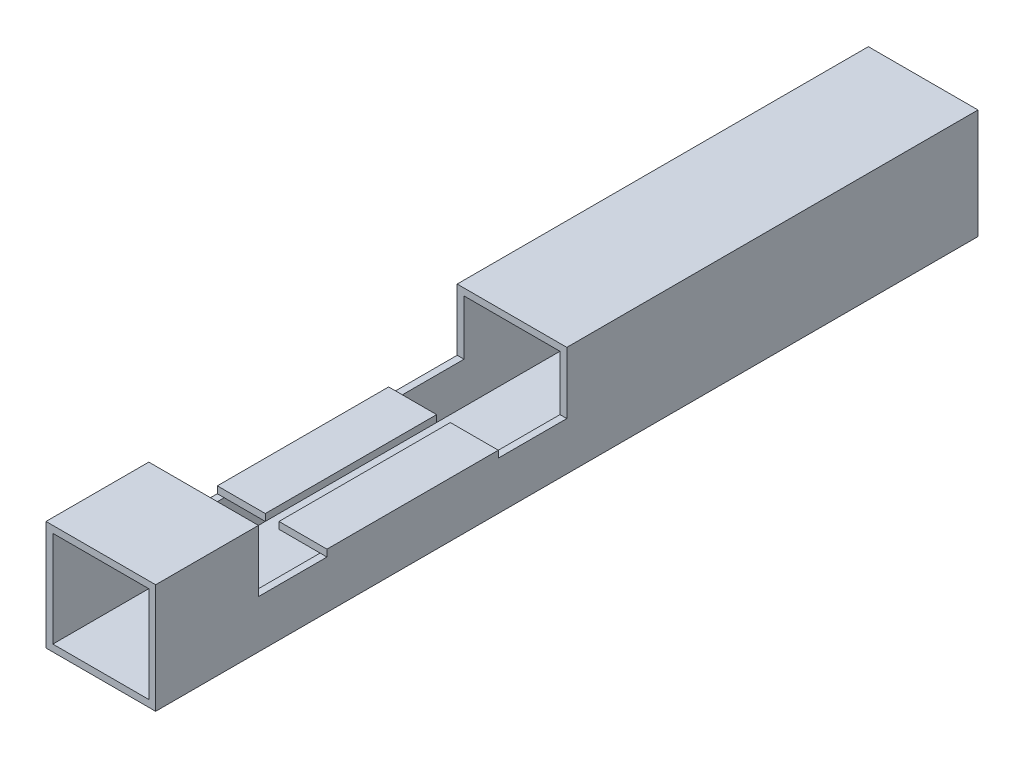
ISO-10303-21;
HEADER;
FILE_DESCRIPTION(('STEP AP214'),'2;1');
FILE_NAME('part.step','',(''),(''),'','','');
FILE_SCHEMA(('AUTOMOTIVE_DESIGN { 1 0 10303 214 1 1 1 1 }'));
ENDSEC;
DATA;
#1=APPLICATION_CONTEXT('core data for automotive mechanical design processes');
#2=APPLICATION_PROTOCOL_DEFINITION('international standard','automotive_design',2000,#1);
#3=PRODUCT_CONTEXT('',#1,'mechanical');
#4=PRODUCT('Part','Part','',(#3));
#5=PRODUCT_RELATED_PRODUCT_CATEGORY('part','',(#4));
#6=PRODUCT_DEFINITION_FORMATION('','',#4);
#7=PRODUCT_DEFINITION_CONTEXT('part definition',#1,'design');
#8=PRODUCT_DEFINITION('design','',#6,#7);
#9=PRODUCT_DEFINITION_SHAPE('','',#8);
#10=(LENGTH_UNIT() NAMED_UNIT(*) SI_UNIT(.MILLI.,.METRE.));
#11=(NAMED_UNIT(*) PLANE_ANGLE_UNIT() SI_UNIT($,.RADIAN.));
#12=(NAMED_UNIT(*) SI_UNIT($,.STERADIAN.) SOLID_ANGLE_UNIT());
#13=UNCERTAINTY_MEASURE_WITH_UNIT(LENGTH_MEASURE(1.E-05),#10,'distance_accuracy_value','');
#14=(GEOMETRIC_REPRESENTATION_CONTEXT(3) GLOBAL_UNCERTAINTY_ASSIGNED_CONTEXT((#13)) GLOBAL_UNIT_ASSIGNED_CONTEXT((#10,
#11,#12)) REPRESENTATION_CONTEXT('',''));
#15=CARTESIAN_POINT('',(0.,0.,0.));
#16=DIRECTION('',(0.,0.,1.));
#17=DIRECTION('',(1.,0.,0.));
#18=AXIS2_PLACEMENT_3D('',#15,#16,#17);
#19=CARTESIAN_POINT('',(-0.0999999999999999,0.,0.));
#20=DIRECTION('',(1.,0.,0.));
#21=DIRECTION('',(0.,0.,-1.));
#22=AXIS2_PLACEMENT_3D('',#19,#20,#21);
#23=PLANE('',#22);
#24=DIRECTION('',(0.,1.,0.));
#25=VECTOR('',#24,1.);
#26=CARTESIAN_POINT('',(-0.0999999999999999,-0.0999999999999999,1.));
#27=LINE('',#26,#25);
#28=CARTESIAN_POINT('',(-0.0999999999999999,-0.0999999999999999,1.));
#29=VERTEX_POINT('',#28);
#30=CARTESIAN_POINT('',(-0.0999999999999999,0.,1.));
#31=VERTEX_POINT('',#30);
#32=EDGE_CURVE('E198',#29,#31,#27,.T.);
#33=ORIENTED_EDGE('',*,*,#32,.T.);
#34=DIRECTION('',(0.,0.,-1.));
#35=VECTOR('',#34,1.);
#36=CARTESIAN_POINT('',(-0.0999999999999999,0.,3.5));
#37=LINE('',#36,#35);
#38=CARTESIAN_POINT('',(-0.0999999999999999,0.,3.5));
#39=VERTEX_POINT('',#38);
#40=EDGE_CURVE('E239',#31,#39,#37,.F.);
#41=ORIENTED_EDGE('',*,*,#40,.T.);
#42=DIRECTION('',(0.,1.,0.));
#43=VECTOR('',#42,1.);
#44=CARTESIAN_POINT('',(-0.0999999999999999,0.,3.5));
#45=LINE('',#44,#43);
#46=CARTESIAN_POINT('',(-0.0999999999999999,-0.0999999999999999,3.5));
#47=VERTEX_POINT('',#46);
#48=EDGE_CURVE('E20',#39,#47,#45,.F.);
#49=ORIENTED_EDGE('',*,*,#48,.T.);
#50=DIRECTION('',(0.,0.,1.));
#51=VECTOR('',#50,1.);
#52=CARTESIAN_POINT('',(-0.0999999999999999,-0.0999999999999999,3.5));
#53=LINE('',#52,#51);
#54=EDGE_CURVE('E185',#47,#29,#53,.F.);
#55=ORIENTED_EDGE('',*,*,#54,.T.);
#56=EDGE_LOOP('',(#33,#41,#49,#55));
#57=FACE_BOUND('',#56,.T.);
#58=ADVANCED_FACE('F17',(#57),#23,.T.);
#59=CARTESIAN_POINT('',(-0.0999999999999999,-0.0999999999999999,3.5));
#60=DIRECTION('',(0.,1.,0.));
#61=DIRECTION('',(0.,0.,1.));
#62=AXIS2_PLACEMENT_3D('',#59,#60,#61);
#63=PLANE('',#62);
#64=DIRECTION('',(1.,0.,0.));
#65=VECTOR('',#64,1.);
#66=CARTESIAN_POINT('',(-0.0999999999999999,-0.0999999999999999,1.));
#67=LINE('',#66,#65);
#68=CARTESIAN_POINT('',(-0.7,-0.0999999999999999,1.));
#69=VERTEX_POINT('',#68);
#70=EDGE_CURVE('E190',#69,#29,#67,.T.);
#71=ORIENTED_EDGE('',*,*,#70,.T.);
#72=ORIENTED_EDGE('',*,*,#54,.F.);
#73=DIRECTION('',(-1.,0.,0.));
#74=VECTOR('',#73,1.);
#75=CARTESIAN_POINT('',(-0.0999999999999999,-0.0999999999999999,3.5));
#76=LINE('',#75,#74);
#77=CARTESIAN_POINT('',(-0.7,-0.0999999999999999,3.5));
#78=VERTEX_POINT('',#77);
#79=EDGE_CURVE('E206',#47,#78,#76,.T.);
#80=ORIENTED_EDGE('',*,*,#79,.T.);
#81=DIRECTION('',(0.,0.,-1.));
#82=VECTOR('',#81,1.);
#83=CARTESIAN_POINT('',(-0.7,-0.0999999999999999,6.));
#84=LINE('',#83,#82);
#85=EDGE_CURVE('E202',#69,#78,#84,.F.);
#86=ORIENTED_EDGE('',*,*,#85,.F.);
#87=EDGE_LOOP('',(#71,#72,#80,#86));
#88=FACE_BOUND('',#87,.T.);
#89=ADVANCED_FACE('F204',(#88),#63,.F.);
#90=CARTESIAN_POINT('',(0.0999999999999999,0.,0.));
#91=DIRECTION('',(-1.,0.,0.));
#92=DIRECTION('',(0.,0.,1.));
#93=AXIS2_PLACEMENT_3D('',#90,#91,#92);
#94=PLANE('',#93);
#95=DIRECTION('',(0.,1.,0.));
#96=VECTOR('',#95,1.);
#97=CARTESIAN_POINT('',(0.0999999999999999,0.,1.));
#98=LINE('',#97,#96);
#99=CARTESIAN_POINT('',(0.0999999999999999,0.,1.));
#100=VERTEX_POINT('',#99);
#101=CARTESIAN_POINT('',(0.0999999999999999,-0.0999999999999999,1.));
#102=VERTEX_POINT('',#101);
#103=EDGE_CURVE('E236',#100,#102,#98,.F.);
#104=ORIENTED_EDGE('',*,*,#103,.T.);
#105=DIRECTION('',(0.,0.,-1.));
#106=VECTOR('',#105,1.);
#107=CARTESIAN_POINT('',(0.0999999999999999,-0.0999999999999999,3.5));
#108=LINE('',#107,#106);
#109=CARTESIAN_POINT('',(0.0999999999999999,-0.0999999999999999,3.5));
#110=VERTEX_POINT('',#109);
#111=EDGE_CURVE('E233',#110,#102,#108,.T.);
#112=ORIENTED_EDGE('',*,*,#111,.F.);
#113=DIRECTION('',(0.,1.,0.));
#114=VECTOR('',#113,1.);
#115=CARTESIAN_POINT('',(0.0999999999999999,-0.0999999999999999,3.5));
#116=LINE('',#115,#114);
#117=CARTESIAN_POINT('',(0.0999999999999999,0.,3.5));
#118=VERTEX_POINT('',#117);
#119=EDGE_CURVE('E339',#118,#110,#116,.F.);
#120=ORIENTED_EDGE('',*,*,#119,.F.);
#121=DIRECTION('',(0.,0.,1.));
#122=VECTOR('',#121,1.);
#123=CARTESIAN_POINT('',(0.0999999999999999,0.,3.5));
#124=LINE('',#123,#122);
#125=EDGE_CURVE('E335',#100,#118,#124,.T.);
#126=ORIENTED_EDGE('',*,*,#125,.F.);
#127=EDGE_LOOP('',(#104,#112,#120,#126));
#128=FACE_BOUND('',#127,.T.);
#129=ADVANCED_FACE('F469',(#128),#94,.T.);
#130=CARTESIAN_POINT('',(0.0999999999999999,-0.0999999999999999,3.5));
#131=DIRECTION('',(0.,-1.,0.));
#132=DIRECTION('',(0.,0.,-1.));
#133=AXIS2_PLACEMENT_3D('',#130,#131,#132);
#134=PLANE('',#133);
#135=DIRECTION('',(1.,0.,0.));
#136=VECTOR('',#135,1.);
#137=CARTESIAN_POINT('',(0.0999999999999999,-0.0999999999999999,3.5));
#138=LINE('',#137,#136);
#139=CARTESIAN_POINT('',(0.7,-0.0999999999999999,3.5));
#140=VERTEX_POINT('',#139);
#141=EDGE_CURVE('E337',#110,#140,#138,.T.);
#142=ORIENTED_EDGE('',*,*,#141,.F.);
#143=ORIENTED_EDGE('',*,*,#111,.T.);
#144=DIRECTION('',(-1.,0.,0.));
#145=VECTOR('',#144,1.);
#146=CARTESIAN_POINT('',(0.0999999999999999,-0.0999999999999999,1.));
#147=LINE('',#146,#145);
#148=CARTESIAN_POINT('',(0.7,-0.0999999999999999,1.));
#149=VERTEX_POINT('',#148);
#150=EDGE_CURVE('E330',#149,#102,#147,.T.);
#151=ORIENTED_EDGE('',*,*,#150,.F.);
#152=DIRECTION('',(0.,0.,1.));
#153=VECTOR('',#152,1.);
#154=CARTESIAN_POINT('',(0.7,-0.0999999999999999,6.));
#155=LINE('',#154,#153);
#156=EDGE_CURVE('E288',#140,#149,#155,.F.);
#157=ORIENTED_EDGE('',*,*,#156,.F.);
#158=EDGE_LOOP('',(#142,#143,#151,#157));
#159=FACE_BOUND('',#158,.T.);
#160=ADVANCED_FACE('F476',(#159),#134,.T.);
#161=CARTESIAN_POINT('',(0.,0.7,6.));
#162=DIRECTION('',(0.,-1.,0.));
#163=DIRECTION('',(0.,0.,-1.));
#164=AXIS2_PLACEMENT_3D('',#161,#162,#163);
#165=PLANE('',#164);
#166=DIRECTION('',(1.,0.,0.));
#167=VECTOR('',#166,1.);
#168=CARTESIAN_POINT('',(0.,0.7,-6.));
#169=LINE('',#168,#167);
#170=CARTESIAN_POINT('',(-0.7,0.7,-6.));
#171=VERTEX_POINT('',#170);
#172=CARTESIAN_POINT('',(0.7,0.7,-6.));
#173=VERTEX_POINT('',#172);
#174=EDGE_CURVE('E231',#171,#173,#169,.T.);
#175=ORIENTED_EDGE('',*,*,#174,.T.);
#176=DIRECTION('',(0.,0.,1.));
#177=VECTOR('',#176,1.);
#178=CARTESIAN_POINT('',(0.7,0.7,6.));
#179=LINE('',#178,#177);
#180=CARTESIAN_POINT('',(0.7,0.7,0.));
#181=VERTEX_POINT('',#180);
#182=EDGE_CURVE('E280',#181,#173,#179,.F.);
#183=ORIENTED_EDGE('',*,*,#182,.F.);
#184=DIRECTION('',(-1.,0.,0.));
#185=VECTOR('',#184,1.);
#186=CARTESIAN_POINT('',(-0.8,0.7,0.));
#187=LINE('',#186,#185);
#188=CARTESIAN_POINT('',(-0.7,0.7,0.));
#189=VERTEX_POINT('',#188);
#190=EDGE_CURVE('E322',#181,#189,#187,.T.);
#191=ORIENTED_EDGE('',*,*,#190,.T.);
#192=DIRECTION('',(0.,0.,-1.));
#193=VECTOR('',#192,1.);
#194=CARTESIAN_POINT('',(-0.7,0.7,6.));
#195=LINE('',#194,#193);
#196=EDGE_CURVE('E218',#171,#189,#195,.F.);
#197=ORIENTED_EDGE('',*,*,#196,.F.);
#198=EDGE_LOOP('',(#175,#183,#191,#197));
#199=FACE_BOUND('',#198,.T.);
#200=ADVANCED_FACE('F406',(#199),#165,.T.);
#201=CARTESIAN_POINT('',(0.,-0.7,6.));
#202=DIRECTION('',(0.,1.,0.));
#203=DIRECTION('',(0.,0.,1.));
#204=AXIS2_PLACEMENT_3D('',#201,#202,#203);
#205=PLANE('',#204);
#206=DIRECTION('',(1.,0.,0.));
#207=VECTOR('',#206,1.);
#208=CARTESIAN_POINT('',(0.,-0.7,6.));
#209=LINE('',#208,#207);
#210=CARTESIAN_POINT('',(-0.7,-0.7,6.));
#211=VERTEX_POINT('',#210);
#212=CARTESIAN_POINT('',(0.7,-0.7,6.));
#213=VERTEX_POINT('',#212);
#214=EDGE_CURVE('E224',#211,#213,#209,.T.);
#215=ORIENTED_EDGE('',*,*,#214,.T.);
#216=DIRECTION('',(0.,0.,1.));
#217=VECTOR('',#216,1.);
#218=CARTESIAN_POINT('',(0.7,-0.7,6.));
#219=LINE('',#218,#217);
#220=CARTESIAN_POINT('',(0.7,-0.7,-6.));
#221=VERTEX_POINT('',#220);
#222=EDGE_CURVE('E277',#221,#213,#219,.T.);
#223=ORIENTED_EDGE('',*,*,#222,.F.);
#224=DIRECTION('',(1.,0.,0.));
#225=VECTOR('',#224,1.);
#226=CARTESIAN_POINT('',(0.,-0.7,-6.));
#227=LINE('',#226,#225);
#228=CARTESIAN_POINT('',(-0.7,-0.7,-6.));
#229=VERTEX_POINT('',#228);
#230=EDGE_CURVE('E226',#221,#229,#227,.F.);
#231=ORIENTED_EDGE('',*,*,#230,.T.);
#232=DIRECTION('',(0.,0.,-1.));
#233=VECTOR('',#232,1.);
#234=CARTESIAN_POINT('',(-0.7,-0.7,6.));
#235=LINE('',#234,#233);
#236=EDGE_CURVE('E345',#211,#229,#235,.T.);
#237=ORIENTED_EDGE('',*,*,#236,.F.);
#238=EDGE_LOOP('',(#215,#223,#231,#237));
#239=FACE_BOUND('',#238,.T.);
#240=ADVANCED_FACE('F398',(#239),#205,.T.);
#241=CARTESIAN_POINT('',(-0.8,-0.0999999999999999,4.5));
#242=DIRECTION('',(0.,-1.,0.));
#243=DIRECTION('',(0.,0.,-1.));
#244=AXIS2_PLACEMENT_3D('',#241,#242,#243);
#245=PLANE('',#244);
#246=DIRECTION('',(0.,0.,-1.));
#247=VECTOR('',#246,1.);
#248=CARTESIAN_POINT('',(-0.7,-0.0999999999999999,6.));
#249=LINE('',#248,#247);
#250=CARTESIAN_POINT('',(-0.7,-0.0999999999999999,0.));
#251=VERTEX_POINT('',#250);
#252=EDGE_CURVE('E210',#251,#69,#249,.F.);
#253=ORIENTED_EDGE('',*,*,#252,.F.);
#254=DIRECTION('',(-1.,0.,0.));
#255=VECTOR('',#254,1.);
#256=CARTESIAN_POINT('',(-0.8,-0.0999999999999999,0.));
#257=LINE('',#256,#255);
#258=CARTESIAN_POINT('',(-0.8,-0.0999999999999999,0.));
#259=VERTEX_POINT('',#258);
#260=EDGE_CURVE('E319',#251,#259,#257,.T.);
#261=ORIENTED_EDGE('',*,*,#260,.T.);
#262=DIRECTION('',(0.,0.,-1.));
#263=VECTOR('',#262,1.);
#264=CARTESIAN_POINT('',(-0.8,-0.0999999999999999,6.));
#265=LINE('',#264,#263);
#266=CARTESIAN_POINT('',(-0.8,-0.0999999999999999,1.));
#267=VERTEX_POINT('',#266);
#268=EDGE_CURVE('E223',#259,#267,#265,.F.);
#269=ORIENTED_EDGE('',*,*,#268,.T.);
#270=DIRECTION('',(1.,0.,0.));
#271=VECTOR('',#270,1.);
#272=CARTESIAN_POINT('',(-0.0999999999999999,-0.0999999999999999,1.));
#273=LINE('',#272,#271);
#274=EDGE_CURVE('E196',#267,#69,#273,.T.);
#275=ORIENTED_EDGE('',*,*,#274,.T.);
#276=EDGE_LOOP('',(#253,#261,#269,#275));
#277=FACE_BOUND('',#276,.T.);
#278=ADVANCED_FACE('F221',(#277),#245,.F.);
#279=CARTESIAN_POINT('',(-0.0999999999999999,-0.0999999999999999,1.));
#280=DIRECTION('',(0.,0.,1.));
#281=DIRECTION('',(1.,0.,0.));
#282=AXIS2_PLACEMENT_3D('',#279,#280,#281);
#283=PLANE('',#282);
#284=DIRECTION('',(1.,0.,0.));
#285=VECTOR('',#284,1.);
#286=CARTESIAN_POINT('',(-0.0999999999999999,0.,1.));
#287=LINE('',#286,#285);
#288=CARTESIAN_POINT('',(-0.8,0.,1.));
#289=VERTEX_POINT('',#288);
#290=EDGE_CURVE('E254',#289,#31,#287,.T.);
#291=ORIENTED_EDGE('',*,*,#290,.T.);
#292=ORIENTED_EDGE('',*,*,#32,.F.);
#293=ORIENTED_EDGE('',*,*,#70,.F.);
#294=ORIENTED_EDGE('',*,*,#274,.F.);
#295=DIRECTION('',(0.,1.,0.));
#296=VECTOR('',#295,1.);
#297=CARTESIAN_POINT('',(-0.8,-0.8,1.));
#298=LINE('',#297,#296);
#299=EDGE_CURVE('E259',#267,#289,#298,.T.);
#300=ORIENTED_EDGE('',*,*,#299,.T.);
#301=EDGE_LOOP('',(#291,#292,#293,#294,#300));
#302=FACE_BOUND('',#301,.T.);
#303=ADVANCED_FACE('F193',(#302),#283,.F.);
#304=CARTESIAN_POINT('',(-0.0999999999999999,0.,3.5));
#305=DIRECTION('',(0.,-1.,0.));
#306=DIRECTION('',(0.,0.,-1.));
#307=AXIS2_PLACEMENT_3D('',#304,#305,#306);
#308=PLANE('',#307);
#309=DIRECTION('',(-1.,0.,0.));
#310=VECTOR('',#309,1.);
#311=CARTESIAN_POINT('',(-0.0999999999999999,0.,3.5));
#312=LINE('',#311,#310);
#313=CARTESIAN_POINT('',(-0.8,0.,3.5));
#314=VERTEX_POINT('',#313);
#315=EDGE_CURVE('E246',#314,#39,#312,.F.);
#316=ORIENTED_EDGE('',*,*,#315,.T.);
#317=ORIENTED_EDGE('',*,*,#40,.F.);
#318=ORIENTED_EDGE('',*,*,#290,.F.);
#319=DIRECTION('',(0.,0.,-1.));
#320=VECTOR('',#319,1.);
#321=CARTESIAN_POINT('',(-0.8,0.,6.));
#322=LINE('',#321,#320);
#323=EDGE_CURVE('E261',#289,#314,#322,.F.);
#324=ORIENTED_EDGE('',*,*,#323,.T.);
#325=EDGE_LOOP('',(#316,#317,#318,#324));
#326=FACE_BOUND('',#325,.T.);
#327=ADVANCED_FACE('F256',(#326),#308,.F.);
#328=CARTESIAN_POINT('',(-0.0999999999999999,-0.0999999999999999,3.5));
#329=DIRECTION('',(0.,0.,-1.));
#330=DIRECTION('',(-1.,0.,0.));
#331=AXIS2_PLACEMENT_3D('',#328,#329,#330);
#332=PLANE('',#331);
#333=DIRECTION('',(1.,0.,0.));
#334=VECTOR('',#333,1.);
#335=CARTESIAN_POINT('',(-0.8,-0.0999999999999999,3.5));
#336=LINE('',#335,#334);
#337=CARTESIAN_POINT('',(-0.8,-0.0999999999999999,3.5));
#338=VERTEX_POINT('',#337);
#339=EDGE_CURVE('E244',#338,#78,#336,.T.);
#340=ORIENTED_EDGE('',*,*,#339,.T.);
#341=ORIENTED_EDGE('',*,*,#79,.F.);
#342=ORIENTED_EDGE('',*,*,#48,.F.);
#343=ORIENTED_EDGE('',*,*,#315,.F.);
#344=DIRECTION('',(0.,1.,0.));
#345=VECTOR('',#344,1.);
#346=CARTESIAN_POINT('',(-0.8,-0.8,3.5));
#347=LINE('',#346,#345);
#348=EDGE_CURVE('E263',#314,#338,#347,.F.);
#349=ORIENTED_EDGE('',*,*,#348,.T.);
#350=EDGE_LOOP('',(#340,#341,#342,#343,#349));
#351=FACE_BOUND('',#350,.T.);
#352=ADVANCED_FACE('F242',(#351),#332,.F.);
#353=CARTESIAN_POINT('',(-0.8,-0.0999999999999999,4.5));
#354=DIRECTION('',(0.,-1.,0.));
#355=DIRECTION('',(0.,0.,-1.));
#356=AXIS2_PLACEMENT_3D('',#353,#354,#355);
#357=PLANE('',#356);
#358=DIRECTION('',(0.,0.,-1.));
#359=VECTOR('',#358,1.);
#360=CARTESIAN_POINT('',(-0.8,-0.0999999999999999,6.));
#361=LINE('',#360,#359);
#362=CARTESIAN_POINT('',(-0.8,-0.0999999999999999,4.5));
#363=VERTEX_POINT('',#362);
#364=EDGE_CURVE('E379',#338,#363,#361,.F.);
#365=ORIENTED_EDGE('',*,*,#364,.T.);
#366=DIRECTION('',(1.,0.,0.));
#367=VECTOR('',#366,1.);
#368=CARTESIAN_POINT('',(-0.8,-0.0999999999999999,4.5));
#369=LINE('',#368,#367);
#370=CARTESIAN_POINT('',(-0.7,-0.0999999999999999,4.5));
#371=VERTEX_POINT('',#370);
#372=EDGE_CURVE('E307',#363,#371,#369,.T.);
#373=ORIENTED_EDGE('',*,*,#372,.T.);
#374=DIRECTION('',(0.,0.,-1.));
#375=VECTOR('',#374,1.);
#376=CARTESIAN_POINT('',(-0.7,-0.0999999999999999,6.));
#377=LINE('',#376,#375);
#378=EDGE_CURVE('E209',#78,#371,#377,.F.);
#379=ORIENTED_EDGE('',*,*,#378,.F.);
#380=ORIENTED_EDGE('',*,*,#339,.F.);
#381=EDGE_LOOP('',(#365,#373,#379,#380));
#382=FACE_BOUND('',#381,.T.);
#383=ADVANCED_FACE('F387',(#382),#357,.F.);
#384=CARTESIAN_POINT('',(0.,0.7,6.));
#385=DIRECTION('',(0.,-1.,0.));
#386=DIRECTION('',(0.,0.,-1.));
#387=AXIS2_PLACEMENT_3D('',#384,#385,#386);
#388=PLANE('',#387);
#389=DIRECTION('',(1.,0.,0.));
#390=VECTOR('',#389,1.);
#391=CARTESIAN_POINT('',(0.,0.7,6.));
#392=LINE('',#391,#390);
#393=CARTESIAN_POINT('',(-0.7,0.7,6.));
#394=VERTEX_POINT('',#393);
#395=CARTESIAN_POINT('',(0.7,0.7,6.));
#396=VERTEX_POINT('',#395);
#397=EDGE_CURVE('E358',#394,#396,#392,.T.);
#398=ORIENTED_EDGE('',*,*,#397,.F.);
#399=DIRECTION('',(0.,0.,-1.));
#400=VECTOR('',#399,1.);
#401=CARTESIAN_POINT('',(-0.7,0.7,6.));
#402=LINE('',#401,#400);
#403=CARTESIAN_POINT('',(-0.7,0.7,4.5));
#404=VERTEX_POINT('',#403);
#405=EDGE_CURVE('E248',#404,#394,#402,.F.);
#406=ORIENTED_EDGE('',*,*,#405,.F.);
#407=DIRECTION('',(1.,0.,0.));
#408=VECTOR('',#407,1.);
#409=CARTESIAN_POINT('',(-0.8,0.7,4.5));
#410=LINE('',#409,#408);
#411=CARTESIAN_POINT('',(0.7,0.7,4.5));
#412=VERTEX_POINT('',#411);
#413=EDGE_CURVE('E302',#404,#412,#410,.T.);
#414=ORIENTED_EDGE('',*,*,#413,.T.);
#415=DIRECTION('',(0.,0.,1.));
#416=VECTOR('',#415,1.);
#417=CARTESIAN_POINT('',(0.7,0.7,6.));
#418=LINE('',#417,#416);
#419=EDGE_CURVE('E274',#396,#412,#418,.F.);
#420=ORIENTED_EDGE('',*,*,#419,.F.);
#421=EDGE_LOOP('',(#398,#406,#414,#420));
#422=FACE_BOUND('',#421,.T.);
#423=ADVANCED_FACE('F364',(#422),#388,.T.);
#424=CARTESIAN_POINT('',(-0.7,0.,6.));
#425=DIRECTION('',(1.,0.,0.));
#426=DIRECTION('',(0.,0.,-1.));
#427=AXIS2_PLACEMENT_3D('',#424,#425,#426);
#428=PLANE('',#427);
#429=ORIENTED_EDGE('',*,*,#85,.T.);
#430=ORIENTED_EDGE('',*,*,#378,.T.);
#431=DIRECTION('',(0.,1.,0.));
#432=VECTOR('',#431,1.);
#433=CARTESIAN_POINT('',(-0.7,0.8,4.5));
#434=LINE('',#433,#432);
#435=EDGE_CURVE('E304',#371,#404,#434,.T.);
#436=ORIENTED_EDGE('',*,*,#435,.T.);
#437=ORIENTED_EDGE('',*,*,#405,.T.);
#438=DIRECTION('',(0.,1.,0.));
#439=VECTOR('',#438,1.);
#440=CARTESIAN_POINT('',(-0.7,0.,6.));
#441=LINE('',#440,#439);
#442=EDGE_CURVE('E349',#211,#394,#441,.T.);
#443=ORIENTED_EDGE('',*,*,#442,.F.);
#444=ORIENTED_EDGE('',*,*,#236,.T.);
#445=DIRECTION('',(0.,1.,0.));
#446=VECTOR('',#445,1.);
#447=CARTESIAN_POINT('',(-0.7,0.,-6.));
#448=LINE('',#447,#446);
#449=EDGE_CURVE('E343',#229,#171,#448,.T.);
#450=ORIENTED_EDGE('',*,*,#449,.T.);
#451=ORIENTED_EDGE('',*,*,#196,.T.);
#452=DIRECTION('',(0.,1.,0.));
#453=VECTOR('',#452,1.);
#454=CARTESIAN_POINT('',(-0.7,0.8,0.));
#455=LINE('',#454,#453);
#456=EDGE_CURVE('E215',#189,#251,#455,.F.);
#457=ORIENTED_EDGE('',*,*,#456,.T.);
#458=ORIENTED_EDGE('',*,*,#252,.T.);
#459=EDGE_LOOP('',(#429,#430,#436,#437,#443,#444,#450,#451,#457,#458));
#460=FACE_BOUND('',#459,.T.);
#461=ADVANCED_FACE('F213',(#460),#428,.T.);
#462=CARTESIAN_POINT('',(0.0999999999999999,-0.0999999999999999,3.5));
#463=DIRECTION('',(0.,0.,1.));
#464=DIRECTION('',(1.,0.,0.));
#465=AXIS2_PLACEMENT_3D('',#462,#463,#464);
#466=PLANE('',#465);
#467=ORIENTED_EDGE('',*,*,#141,.T.);
#468=DIRECTION('',(1.,0.,0.));
#469=VECTOR('',#468,1.);
#470=CARTESIAN_POINT('',(-0.8,-0.0999999999999999,3.5));
#471=LINE('',#470,#469);
#472=CARTESIAN_POINT('',(0.8,-0.0999999999999999,3.5));
#473=VERTEX_POINT('',#472);
#474=EDGE_CURVE('E296',#140,#473,#471,.T.);
#475=ORIENTED_EDGE('',*,*,#474,.T.);
#476=DIRECTION('',(0.,1.,0.));
#477=VECTOR('',#476,1.);
#478=CARTESIAN_POINT('',(0.8,-0.8,3.5));
#479=LINE('',#478,#477);
#480=CARTESIAN_POINT('',(0.8,0.,3.5));
#481=VERTEX_POINT('',#480);
#482=EDGE_CURVE('E361',#473,#481,#479,.T.);
#483=ORIENTED_EDGE('',*,*,#482,.T.);
#484=DIRECTION('',(1.,0.,0.));
#485=VECTOR('',#484,1.);
#486=CARTESIAN_POINT('',(0.0999999999999999,0.,3.5));
#487=LINE('',#486,#485);
#488=EDGE_CURVE('E333',#118,#481,#487,.T.);
#489=ORIENTED_EDGE('',*,*,#488,.F.);
#490=ORIENTED_EDGE('',*,*,#119,.T.);
#491=EDGE_LOOP('',(#467,#475,#483,#489,#490));
#492=FACE_BOUND('',#491,.T.);
#493=ADVANCED_FACE('F453',(#492),#466,.T.);
#494=CARTESIAN_POINT('',(0.0999999999999999,0.,3.5));
#495=DIRECTION('',(0.,1.,0.));
#496=DIRECTION('',(0.,0.,1.));
#497=AXIS2_PLACEMENT_3D('',#494,#495,#496);
#498=PLANE('',#497);
#499=ORIENTED_EDGE('',*,*,#125,.T.);
#500=ORIENTED_EDGE('',*,*,#488,.T.);
#501=DIRECTION('',(0.,0.,1.));
#502=VECTOR('',#501,1.);
#503=CARTESIAN_POINT('',(0.8,0.,6.));
#504=LINE('',#503,#502);
#505=CARTESIAN_POINT('',(0.8,0.,1.));
#506=VERTEX_POINT('',#505);
#507=EDGE_CURVE('E447',#481,#506,#504,.F.);
#508=ORIENTED_EDGE('',*,*,#507,.T.);
#509=DIRECTION('',(-1.,0.,0.));
#510=VECTOR('',#509,1.);
#511=CARTESIAN_POINT('',(0.0999999999999999,0.,1.));
#512=LINE('',#511,#510);
#513=EDGE_CURVE('E328',#100,#506,#512,.F.);
#514=ORIENTED_EDGE('',*,*,#513,.F.);
#515=EDGE_LOOP('',(#499,#500,#508,#514));
#516=FACE_BOUND('',#515,.T.);
#517=ADVANCED_FACE('F464',(#516),#498,.T.);
#518=CARTESIAN_POINT('',(0.0999999999999999,-0.0999999999999999,1.));
#519=DIRECTION('',(0.,0.,-1.));
#520=DIRECTION('',(-1.,0.,0.));
#521=AXIS2_PLACEMENT_3D('',#518,#519,#520);
#522=PLANE('',#521);
#523=ORIENTED_EDGE('',*,*,#103,.F.);
#524=ORIENTED_EDGE('',*,*,#513,.T.);
#525=DIRECTION('',(0.,1.,0.));
#526=VECTOR('',#525,1.);
#527=CARTESIAN_POINT('',(0.8,-0.8,1.));
#528=LINE('',#527,#526);
#529=CARTESIAN_POINT('',(0.8,-0.0999999999999999,1.));
#530=VERTEX_POINT('',#529);
#531=EDGE_CURVE('E444',#506,#530,#528,.F.);
#532=ORIENTED_EDGE('',*,*,#531,.T.);
#533=DIRECTION('',(1.,0.,0.));
#534=VECTOR('',#533,1.);
#535=CARTESIAN_POINT('',(-0.8,-0.0999999999999999,1.));
#536=LINE('',#535,#534);
#537=EDGE_CURVE('E325',#530,#149,#536,.F.);
#538=ORIENTED_EDGE('',*,*,#537,.T.);
#539=ORIENTED_EDGE('',*,*,#150,.T.);
#540=EDGE_LOOP('',(#523,#524,#532,#538,#539));
#541=FACE_BOUND('',#540,.T.);
#542=ADVANCED_FACE('F478',(#541),#522,.T.);
#543=CARTESIAN_POINT('',(-0.8,-0.0999999999999999,4.5));
#544=DIRECTION('',(0.,-1.,0.));
#545=DIRECTION('',(0.,0.,-1.));
#546=AXIS2_PLACEMENT_3D('',#543,#544,#545);
#547=PLANE('',#546);
#548=ORIENTED_EDGE('',*,*,#537,.F.);
#549=DIRECTION('',(0.,0.,1.));
#550=VECTOR('',#549,1.);
#551=CARTESIAN_POINT('',(0.8,-0.0999999999999999,6.));
#552=LINE('',#551,#550);
#553=CARTESIAN_POINT('',(0.8,-0.0999999999999999,0.));
#554=VERTEX_POINT('',#553);
#555=EDGE_CURVE('E441',#530,#554,#552,.F.);
#556=ORIENTED_EDGE('',*,*,#555,.T.);
#557=DIRECTION('',(-1.,0.,0.));
#558=VECTOR('',#557,1.);
#559=CARTESIAN_POINT('',(-0.8,-0.0999999999999999,0.));
#560=LINE('',#559,#558);
#561=CARTESIAN_POINT('',(0.7,-0.0999999999999999,0.));
#562=VERTEX_POINT('',#561);
#563=EDGE_CURVE('E316',#554,#562,#560,.T.);
#564=ORIENTED_EDGE('',*,*,#563,.T.);
#565=DIRECTION('',(0.,0.,1.));
#566=VECTOR('',#565,1.);
#567=CARTESIAN_POINT('',(0.7,-0.0999999999999999,6.));
#568=LINE('',#567,#566);
#569=EDGE_CURVE('E286',#149,#562,#568,.F.);
#570=ORIENTED_EDGE('',*,*,#569,.F.);
#571=EDGE_LOOP('',(#548,#556,#564,#570));
#572=FACE_BOUND('',#571,.T.);
#573=ADVANCED_FACE('F481',(#572),#547,.F.);
#574=CARTESIAN_POINT('',(-0.8,0.8,0.));
#575=DIRECTION('',(0.,0.,-1.));
#576=DIRECTION('',(-1.,0.,0.));
#577=AXIS2_PLACEMENT_3D('',#574,#575,#576);
#578=PLANE('',#577);
#579=ORIENTED_EDGE('',*,*,#563,.F.);
#580=DIRECTION('',(0.,1.,0.));
#581=VECTOR('',#580,1.);
#582=CARTESIAN_POINT('',(0.8,-0.8,0.));
#583=LINE('',#582,#581);
#584=CARTESIAN_POINT('',(0.8,0.8,0.));
#585=VERTEX_POINT('',#584);
#586=EDGE_CURVE('E438',#554,#585,#583,.T.);
#587=ORIENTED_EDGE('',*,*,#586,.T.);
#588=DIRECTION('',(1.,0.,0.));
#589=VECTOR('',#588,1.);
#590=CARTESIAN_POINT('',(-0.8,0.8,0.));
#591=LINE('',#590,#589);
#592=CARTESIAN_POINT('',(-0.8,0.8,0.));
#593=VERTEX_POINT('',#592);
#594=EDGE_CURVE('E312',#585,#593,#591,.F.);
#595=ORIENTED_EDGE('',*,*,#594,.T.);
#596=DIRECTION('',(0.,1.,0.));
#597=VECTOR('',#596,1.);
#598=CARTESIAN_POINT('',(-0.8,-0.8,0.));
#599=LINE('',#598,#597);
#600=EDGE_CURVE('E265',#593,#259,#599,.F.);
#601=ORIENTED_EDGE('',*,*,#600,.T.);
#602=ORIENTED_EDGE('',*,*,#260,.F.);
#603=ORIENTED_EDGE('',*,*,#456,.F.);
#604=ORIENTED_EDGE('',*,*,#190,.F.);
#605=DIRECTION('',(0.,1.,0.));
#606=VECTOR('',#605,1.);
#607=CARTESIAN_POINT('',(0.7,0.,0.));
#608=LINE('',#607,#606);
#609=EDGE_CURVE('E283',#562,#181,#608,.T.);
#610=ORIENTED_EDGE('',*,*,#609,.F.);
#611=EDGE_LOOP('',(#579,#587,#595,#601,#602,#603,#604,#610));
#612=FACE_BOUND('',#611,.T.);
#613=ADVANCED_FACE('F408',(#612),#578,.F.);
#614=CARTESIAN_POINT('',(-0.8,0.8,6.));
#615=DIRECTION('',(0.,-1.,0.));
#616=DIRECTION('',(0.,0.,-1.));
#617=AXIS2_PLACEMENT_3D('',#614,#615,#616);
#618=PLANE('',#617);
#619=ORIENTED_EDGE('',*,*,#594,.F.);
#620=DIRECTION('',(0.,0.,1.));
#621=VECTOR('',#620,1.);
#622=CARTESIAN_POINT('',(0.8,0.8,6.));
#623=LINE('',#622,#621);
#624=CARTESIAN_POINT('',(0.8,0.8,-6.));
#625=VERTEX_POINT('',#624);
#626=EDGE_CURVE('E418',#585,#625,#623,.F.);
#627=ORIENTED_EDGE('',*,*,#626,.T.);
#628=DIRECTION('',(1.,0.,0.));
#629=VECTOR('',#628,1.);
#630=CARTESIAN_POINT('',(-0.8,0.8,-6.));
#631=LINE('',#630,#629);
#632=CARTESIAN_POINT('',(-0.8,0.8,-6.));
#633=VERTEX_POINT('',#632);
#634=EDGE_CURVE('E314',#633,#625,#631,.T.);
#635=ORIENTED_EDGE('',*,*,#634,.F.);
#636=DIRECTION('',(0.,0.,-1.));
#637=VECTOR('',#636,1.);
#638=CARTESIAN_POINT('',(-0.8,0.8,6.));
#639=LINE('',#638,#637);
#640=EDGE_CURVE('E271',#633,#593,#639,.F.);
#641=ORIENTED_EDGE('',*,*,#640,.T.);
#642=EDGE_LOOP('',(#619,#627,#635,#641));
#643=FACE_BOUND('',#642,.T.);
#644=ADVANCED_FACE('F415',(#643),#618,.F.);
#645=CARTESIAN_POINT('',(-0.8,0.8,6.));
#646=DIRECTION('',(0.,-1.,0.));
#647=DIRECTION('',(0.,0.,-1.));
#648=AXIS2_PLACEMENT_3D('',#645,#646,#647);
#649=PLANE('',#648);
#650=DIRECTION('',(1.,0.,0.));
#651=VECTOR('',#650,1.);
#652=CARTESIAN_POINT('',(-0.8,0.8,4.5));
#653=LINE('',#652,#651);
#654=CARTESIAN_POINT('',(0.8,0.8,4.5));
#655=VERTEX_POINT('',#654);
#656=CARTESIAN_POINT('',(-0.8,0.8,4.5));
#657=VERTEX_POINT('',#656);
#658=EDGE_CURVE('E310',#655,#657,#653,.F.);
#659=ORIENTED_EDGE('',*,*,#658,.T.);
#660=DIRECTION('',(0.,0.,-1.));
#661=VECTOR('',#660,1.);
#662=CARTESIAN_POINT('',(-0.8,0.8,6.));
#663=LINE('',#662,#661);
#664=CARTESIAN_POINT('',(-0.8,0.8,6.));
#665=VERTEX_POINT('',#664);
#666=EDGE_CURVE('E373',#657,#665,#663,.F.);
#667=ORIENTED_EDGE('',*,*,#666,.T.);
#668=DIRECTION('',(1.,0.,0.));
#669=VECTOR('',#668,1.);
#670=CARTESIAN_POINT('',(0.,0.8,6.));
#671=LINE('',#670,#669);
#672=CARTESIAN_POINT('',(0.8,0.8,6.));
#673=VERTEX_POINT('',#672);
#674=EDGE_CURVE('E369',#673,#665,#671,.F.);
#675=ORIENTED_EDGE('',*,*,#674,.F.);
#676=DIRECTION('',(0.,0.,1.));
#677=VECTOR('',#676,1.);
#678=CARTESIAN_POINT('',(0.8,0.8,6.));
#679=LINE('',#678,#677);
#680=EDGE_CURVE('E431',#673,#655,#679,.F.);
#681=ORIENTED_EDGE('',*,*,#680,.T.);
#682=EDGE_LOOP('',(#659,#667,#675,#681));
#683=FACE_BOUND('',#682,.T.);
#684=ADVANCED_FACE('F497',(#683),#649,.F.);
#685=CARTESIAN_POINT('',(-0.8,0.8,4.5));
#686=DIRECTION('',(0.,0.,1.));
#687=DIRECTION('',(1.,0.,0.));
#688=AXIS2_PLACEMENT_3D('',#685,#686,#687);
#689=PLANE('',#688);
#690=ORIENTED_EDGE('',*,*,#413,.F.);
#691=ORIENTED_EDGE('',*,*,#435,.F.);
#692=ORIENTED_EDGE('',*,*,#372,.F.);
#693=DIRECTION('',(0.,1.,0.));
#694=VECTOR('',#693,1.);
#695=CARTESIAN_POINT('',(-0.8,-0.8,4.5));
#696=LINE('',#695,#694);
#697=EDGE_CURVE('E376',#363,#657,#696,.T.);
#698=ORIENTED_EDGE('',*,*,#697,.T.);
#699=ORIENTED_EDGE('',*,*,#658,.F.);
#700=DIRECTION('',(0.,1.,0.));
#701=VECTOR('',#700,1.);
#702=CARTESIAN_POINT('',(0.8,-0.8,4.5));
#703=LINE('',#702,#701);
#704=CARTESIAN_POINT('',(0.8,-0.0999999999999999,4.5));
#705=VERTEX_POINT('',#704);
#706=EDGE_CURVE('E425',#655,#705,#703,.F.);
#707=ORIENTED_EDGE('',*,*,#706,.T.);
#708=DIRECTION('',(1.,0.,0.));
#709=VECTOR('',#708,1.);
#710=CARTESIAN_POINT('',(-0.8,-0.0999999999999999,4.5));
#711=LINE('',#710,#709);
#712=CARTESIAN_POINT('',(0.7,-0.0999999999999999,4.5));
#713=VERTEX_POINT('',#712);
#714=EDGE_CURVE('E299',#705,#713,#711,.F.);
#715=ORIENTED_EDGE('',*,*,#714,.T.);
#716=DIRECTION('',(0.,1.,0.));
#717=VECTOR('',#716,1.);
#718=CARTESIAN_POINT('',(0.7,0.,4.5));
#719=LINE('',#718,#717);
#720=EDGE_CURVE('E294',#412,#713,#719,.F.);
#721=ORIENTED_EDGE('',*,*,#720,.F.);
#722=EDGE_LOOP('',(#690,#691,#692,#698,#699,#707,#715,#721));
#723=FACE_BOUND('',#722,.T.);
#724=ADVANCED_FACE('F389',(#723),#689,.F.);
#725=CARTESIAN_POINT('',(-0.8,-0.0999999999999999,4.5));
#726=DIRECTION('',(0.,-1.,0.));
#727=DIRECTION('',(0.,0.,-1.));
#728=AXIS2_PLACEMENT_3D('',#725,#726,#727);
#729=PLANE('',#728);
#730=ORIENTED_EDGE('',*,*,#474,.F.);
#731=DIRECTION('',(0.,0.,1.));
#732=VECTOR('',#731,1.);
#733=CARTESIAN_POINT('',(0.7,-0.0999999999999999,6.));
#734=LINE('',#733,#732);
#735=EDGE_CURVE('E291',#713,#140,#734,.F.);
#736=ORIENTED_EDGE('',*,*,#735,.F.);
#737=ORIENTED_EDGE('',*,*,#714,.F.);
#738=DIRECTION('',(0.,0.,1.));
#739=VECTOR('',#738,1.);
#740=CARTESIAN_POINT('',(0.8,-0.0999999999999999,6.));
#741=LINE('',#740,#739);
#742=EDGE_CURVE('E421',#705,#473,#741,.F.);
#743=ORIENTED_EDGE('',*,*,#742,.T.);
#744=EDGE_LOOP('',(#730,#736,#737,#743));
#745=FACE_BOUND('',#744,.T.);
#746=ADVANCED_FACE('F475',(#745),#729,.F.);
#747=CARTESIAN_POINT('',(0.7,0.,6.));
#748=DIRECTION('',(-1.,0.,0.));
#749=DIRECTION('',(0.,0.,1.));
#750=AXIS2_PLACEMENT_3D('',#747,#748,#749);
#751=PLANE('',#750);
#752=DIRECTION('',(0.,1.,0.));
#753=VECTOR('',#752,1.);
#754=CARTESIAN_POINT('',(0.7,0.,6.));
#755=LINE('',#754,#753);
#756=EDGE_CURVE('E362',#396,#213,#755,.F.);
#757=ORIENTED_EDGE('',*,*,#756,.F.);
#758=ORIENTED_EDGE('',*,*,#419,.T.);
#759=ORIENTED_EDGE('',*,*,#720,.T.);
#760=ORIENTED_EDGE('',*,*,#735,.T.);
#761=ORIENTED_EDGE('',*,*,#156,.T.);
#762=ORIENTED_EDGE('',*,*,#569,.T.);
#763=ORIENTED_EDGE('',*,*,#609,.T.);
#764=ORIENTED_EDGE('',*,*,#182,.T.);
#765=DIRECTION('',(0.,1.,0.));
#766=VECTOR('',#765,1.);
#767=CARTESIAN_POINT('',(0.7,0.,-6.));
#768=LINE('',#767,#766);
#769=EDGE_CURVE('E396',#173,#221,#768,.F.);
#770=ORIENTED_EDGE('',*,*,#769,.T.);
#771=ORIENTED_EDGE('',*,*,#222,.T.);
#772=EDGE_LOOP('',(#757,#758,#759,#760,#761,#762,#763,#764,#770,#771));
#773=FACE_BOUND('',#772,.T.);
#774=ADVANCED_FACE('F392',(#773),#751,.T.);
#775=CARTESIAN_POINT('',(-0.8,-0.8,6.));
#776=DIRECTION('',(1.,0.,0.));
#777=DIRECTION('',(0.,0.,-1.));
#778=AXIS2_PLACEMENT_3D('',#775,#776,#777);
#779=PLANE('',#778);
#780=ORIENTED_EDGE('',*,*,#697,.F.);
#781=ORIENTED_EDGE('',*,*,#364,.F.);
#782=ORIENTED_EDGE('',*,*,#348,.F.);
#783=ORIENTED_EDGE('',*,*,#323,.F.);
#784=ORIENTED_EDGE('',*,*,#299,.F.);
#785=ORIENTED_EDGE('',*,*,#268,.F.);
#786=ORIENTED_EDGE('',*,*,#600,.F.);
#787=ORIENTED_EDGE('',*,*,#640,.F.);
#788=DIRECTION('',(0.,1.,0.));
#789=VECTOR('',#788,1.);
#790=CARTESIAN_POINT('',(-0.8,0.,-6.));
#791=LINE('',#790,#789);
#792=CARTESIAN_POINT('',(-0.8,-0.8,-6.));
#793=VERTEX_POINT('',#792);
#794=EDGE_CURVE('E419',#633,#793,#791,.F.);
#795=ORIENTED_EDGE('',*,*,#794,.T.);
#796=DIRECTION('',(0.,0.,1.));
#797=VECTOR('',#796,1.);
#798=CARTESIAN_POINT('',(-0.8,-0.8,6.));
#799=LINE('',#798,#797);
#800=CARTESIAN_POINT('',(-0.8,-0.8,6.));
#801=VERTEX_POINT('',#800);
#802=EDGE_CURVE('E491',#793,#801,#799,.T.);
#803=ORIENTED_EDGE('',*,*,#802,.T.);
#804=DIRECTION('',(0.,1.,0.));
#805=VECTOR('',#804,1.);
#806=CARTESIAN_POINT('',(-0.8,0.,6.));
#807=LINE('',#806,#805);
#808=EDGE_CURVE('E366',#665,#801,#807,.F.);
#809=ORIENTED_EDGE('',*,*,#808,.F.);
#810=ORIENTED_EDGE('',*,*,#666,.F.);
#811=EDGE_LOOP('',(#780,#781,#782,#783,#784,#785,#786,#787,#795,#803,#809,#810));
#812=FACE_BOUND('',#811,.T.);
#813=ADVANCED_FACE('F384',(#812),#779,.F.);
#814=CARTESIAN_POINT('',(0.,0.,6.));
#815=DIRECTION('',(0.,0.,1.));
#816=DIRECTION('',(1.,0.,0.));
#817=AXIS2_PLACEMENT_3D('',#814,#815,#816);
#818=PLANE('',#817);
#819=ORIENTED_EDGE('',*,*,#214,.F.);
#820=ORIENTED_EDGE('',*,*,#442,.T.);
#821=ORIENTED_EDGE('',*,*,#397,.T.);
#822=ORIENTED_EDGE('',*,*,#756,.T.);
#823=EDGE_LOOP('',(#819,#820,#821,#822));
#824=FACE_BOUND('',#823,.T.);
#825=ORIENTED_EDGE('',*,*,#808,.T.);
#826=DIRECTION('',(1.,0.,0.));
#827=VECTOR('',#826,1.);
#828=CARTESIAN_POINT('',(-0.8,-0.8,6.));
#829=LINE('',#828,#827);
#830=CARTESIAN_POINT('',(0.8,-0.8,6.));
#831=VERTEX_POINT('',#830);
#832=EDGE_CURVE('E489',#801,#831,#829,.T.);
#833=ORIENTED_EDGE('',*,*,#832,.T.);
#834=DIRECTION('',(0.,1.,0.));
#835=VECTOR('',#834,1.);
#836=CARTESIAN_POINT('',(0.8,-0.8,6.));
#837=LINE('',#836,#835);
#838=EDGE_CURVE('E434',#831,#673,#837,.T.);
#839=ORIENTED_EDGE('',*,*,#838,.T.);
#840=ORIENTED_EDGE('',*,*,#674,.T.);
#841=EDGE_LOOP('',(#825,#833,#839,#840));
#842=FACE_BOUND('',#841,.T.);
#843=ADVANCED_FACE('F355',(#824,#842),#818,.T.);
#844=CARTESIAN_POINT('',(0.8,-0.8,6.));
#845=DIRECTION('',(-1.,0.,0.));
#846=DIRECTION('',(0.,0.,1.));
#847=AXIS2_PLACEMENT_3D('',#844,#845,#846);
#848=PLANE('',#847);
#849=ORIENTED_EDGE('',*,*,#706,.F.);
#850=ORIENTED_EDGE('',*,*,#680,.F.);
#851=ORIENTED_EDGE('',*,*,#838,.F.);
#852=DIRECTION('',(0.,0.,1.));
#853=VECTOR('',#852,1.);
#854=CARTESIAN_POINT('',(0.8,-0.8,6.));
#855=LINE('',#854,#853);
#856=CARTESIAN_POINT('',(0.8,-0.8,-6.));
#857=VERTEX_POINT('',#856);
#858=EDGE_CURVE('E26',#831,#857,#855,.F.);
#859=ORIENTED_EDGE('',*,*,#858,.T.);
#860=DIRECTION('',(0.,1.,0.));
#861=VECTOR('',#860,1.);
#862=CARTESIAN_POINT('',(0.8,0.,-6.));
#863=LINE('',#862,#861);
#864=EDGE_CURVE('E34',#857,#625,#863,.T.);
#865=ORIENTED_EDGE('',*,*,#864,.T.);
#866=ORIENTED_EDGE('',*,*,#626,.F.);
#867=ORIENTED_EDGE('',*,*,#586,.F.);
#868=ORIENTED_EDGE('',*,*,#555,.F.);
#869=ORIENTED_EDGE('',*,*,#531,.F.);
#870=ORIENTED_EDGE('',*,*,#507,.F.);
#871=ORIENTED_EDGE('',*,*,#482,.F.);
#872=ORIENTED_EDGE('',*,*,#742,.F.);
#873=EDGE_LOOP('',(#849,#850,#851,#859,#865,#866,#867,#868,#869,#870,#871,#872));
#874=FACE_BOUND('',#873,.T.);
#875=ADVANCED_FACE('F459',(#874),#848,.F.);
#876=CARTESIAN_POINT('',(0.,0.,-6.));
#877=DIRECTION('',(0.,0.,1.));
#878=DIRECTION('',(1.,0.,0.));
#879=AXIS2_PLACEMENT_3D('',#876,#877,#878);
#880=PLANE('',#879);
#881=ORIENTED_EDGE('',*,*,#174,.F.);
#882=ORIENTED_EDGE('',*,*,#449,.F.);
#883=ORIENTED_EDGE('',*,*,#230,.F.);
#884=ORIENTED_EDGE('',*,*,#769,.F.);
#885=EDGE_LOOP('',(#881,#882,#883,#884));
#886=FACE_BOUND('',#885,.T.);
#887=DIRECTION('',(1.,0.,0.));
#888=VECTOR('',#887,1.);
#889=CARTESIAN_POINT('',(-0.8,-0.8,-6.));
#890=LINE('',#889,#888);
#891=EDGE_CURVE('E11',#857,#793,#890,.F.);
#892=ORIENTED_EDGE('',*,*,#891,.T.);
#893=ORIENTED_EDGE('',*,*,#794,.F.);
#894=ORIENTED_EDGE('',*,*,#634,.T.);
#895=ORIENTED_EDGE('',*,*,#864,.F.);
#896=EDGE_LOOP('',(#892,#893,#894,#895));
#897=FACE_BOUND('',#896,.T.);
#898=ADVANCED_FACE('F402',(#886,#897),#880,.F.);
#899=CARTESIAN_POINT('',(-0.8,-0.8,6.));
#900=DIRECTION('',(0.,1.,0.));
#901=DIRECTION('',(0.,0.,1.));
#902=AXIS2_PLACEMENT_3D('',#899,#900,#901);
#903=PLANE('',#902);
#904=ORIENTED_EDGE('',*,*,#858,.F.);
#905=ORIENTED_EDGE('',*,*,#832,.F.);
#906=ORIENTED_EDGE('',*,*,#802,.F.);
#907=ORIENTED_EDGE('',*,*,#891,.F.);
#908=EDGE_LOOP('',(#904,#905,#906,#907));
#909=FACE_BOUND('',#908,.T.);
#910=ADVANCED_FACE('F495',(#909),#903,.F.);
#911=CLOSED_SHELL('',(#58,#89,#129,#160,#200,#240,#278,#303,#327,#352,#383,#423,#461,#493,#517,
#542,#573,#613,#644,#684,#724,#746,#774,#813,#843,#875,#898,#910));
#912=MANIFOLD_SOLID_BREP('B1',#911);
#913=ADVANCED_BREP_SHAPE_REPRESENTATION('',(#18,#912),#14);
#914=SHAPE_DEFINITION_REPRESENTATION(#9,#913);
ENDSEC;
END-ISO-10303-21;
